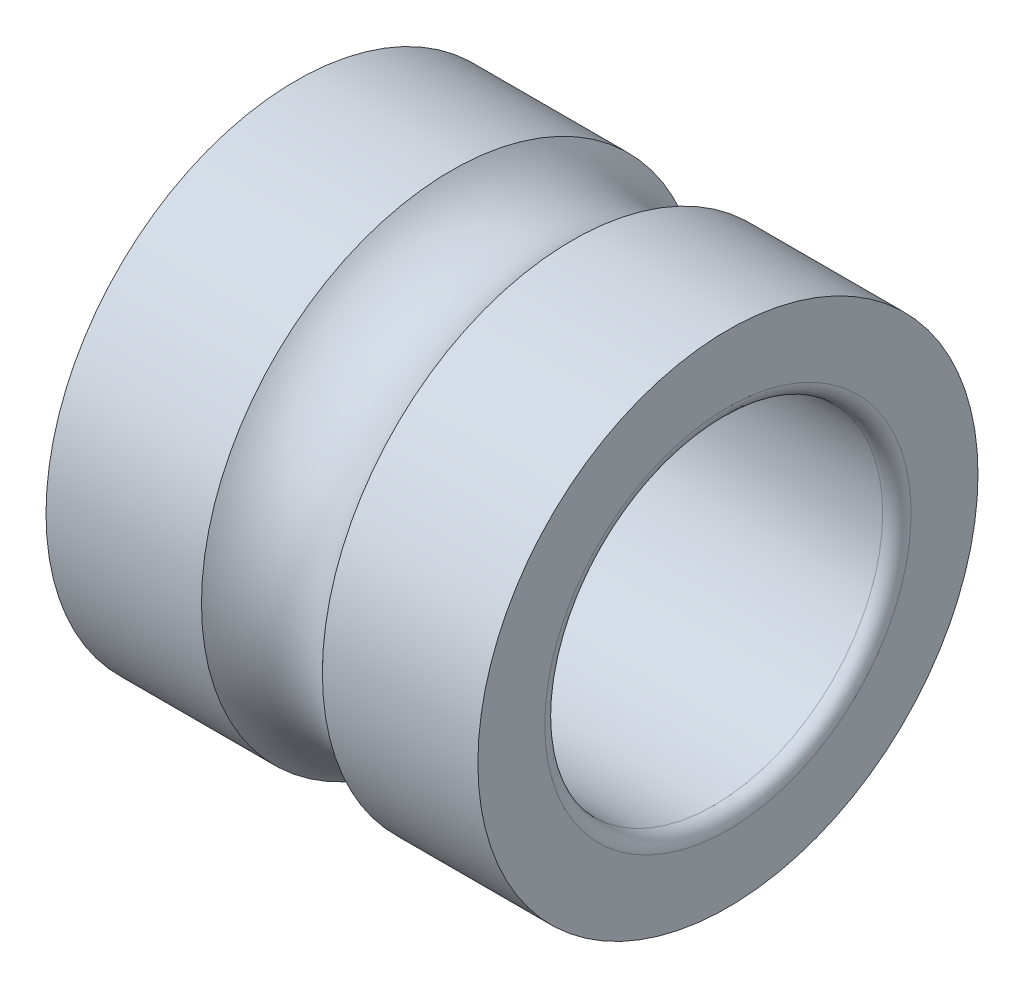
ISO-10303-21;
HEADER;
FILE_DESCRIPTION(('STEP AP214'),'2;1');
FILE_NAME('part.step','',(''),(''),'','','');
FILE_SCHEMA(('AUTOMOTIVE_DESIGN { 1 0 10303 214 1 1 1 1 }'));
ENDSEC;
DATA;
#1=APPLICATION_CONTEXT('core data for automotive mechanical design processes');
#2=APPLICATION_PROTOCOL_DEFINITION('international standard','automotive_design',2000,#1);
#3=PRODUCT_CONTEXT('',#1,'mechanical');
#4=PRODUCT('Part','Part','',(#3));
#5=PRODUCT_RELATED_PRODUCT_CATEGORY('part','',(#4));
#6=PRODUCT_DEFINITION_FORMATION('','',#4);
#7=PRODUCT_DEFINITION_CONTEXT('part definition',#1,'design');
#8=PRODUCT_DEFINITION('design','',#6,#7);
#9=PRODUCT_DEFINITION_SHAPE('','',#8);
#10=(LENGTH_UNIT() NAMED_UNIT(*) SI_UNIT(.MILLI.,.METRE.));
#11=(NAMED_UNIT(*) PLANE_ANGLE_UNIT() SI_UNIT($,.RADIAN.));
#12=(NAMED_UNIT(*) SI_UNIT($,.STERADIAN.) SOLID_ANGLE_UNIT());
#13=UNCERTAINTY_MEASURE_WITH_UNIT(LENGTH_MEASURE(1.E-05),#10,'distance_accuracy_value','');
#14=(GEOMETRIC_REPRESENTATION_CONTEXT(3) GLOBAL_UNCERTAINTY_ASSIGNED_CONTEXT((#13)) GLOBAL_UNIT_ASSIGNED_CONTEXT((#10,
#11,#12)) REPRESENTATION_CONTEXT('',''));
#15=CARTESIAN_POINT('',(0.,0.,0.));
#16=DIRECTION('',(0.,0.,1.));
#17=DIRECTION('',(1.,0.,0.));
#18=AXIS2_PLACEMENT_3D('',#15,#16,#17);
#19=CARTESIAN_POINT('',(-31.9494584837546,0.,0.));
#20=DIRECTION('',(1.,0.,0.));
#21=DIRECTION('',(0.,0.,-1.));
#22=AXIS2_PLACEMENT_3D('',#19,#20,#21);
#23=PLANE('',#22);
#24=CARTESIAN_POINT('',(-31.9494584837545,0.,0.));
#25=DIRECTION('',(-1.,0.,0.));
#26=DIRECTION('',(0.,0.,1.));
#27=AXIS2_PLACEMENT_3D('',#24,#25,#26);
#28=CIRCLE('',#27,27.1);
#29=CARTESIAN_POINT('',(-31.9494584837545,0.,27.1));
#30=VERTEX_POINT('',#29);
#31=EDGE_CURVE('E10',#30,#30,#28,.T.);
#32=ORIENTED_EDGE('',*,*,#31,.F.);
#33=EDGE_LOOP('',(#32));
#34=FACE_BOUND('',#33,.T.);
#35=CARTESIAN_POINT('',(-31.9494584837546,0.,0.));
#36=DIRECTION('',(-1.,0.,0.));
#37=DIRECTION('',(0.,0.,1.));
#38=AXIS2_PLACEMENT_3D('',#35,#36,#37);
#39=CIRCLE('',#38,37.);
#40=CARTESIAN_POINT('',(-31.9494584837546,0.,37.));
#41=VERTEX_POINT('',#40);
#42=EDGE_CURVE('E72',#41,#41,#39,.T.);
#43=ORIENTED_EDGE('',*,*,#42,.T.);
#44=EDGE_LOOP('',(#43));
#45=FACE_BOUND('',#44,.T.);
#46=ADVANCED_FACE('F37',(#34,#45),#23,.F.);
#47=CARTESIAN_POINT('',(-29.8494584837545,0.,0.));
#48=DIRECTION('',(-1.,0.,0.));
#49=DIRECTION('',(0.,0.,1.));
#50=AXIS2_PLACEMENT_3D('',#47,#48,#49);
#51=TOROIDAL_SURFACE('',#50,27.1,2.1);
#52=CARTESIAN_POINT('',(-29.8494584837545,0.,0.));
#53=DIRECTION('',(-1.,0.,0.));
#54=DIRECTION('',(0.,0.,1.));
#55=AXIS2_PLACEMENT_3D('',#52,#53,#54);
#56=CIRCLE('',#55,25.);
#57=CARTESIAN_POINT('',(-29.8494584837545,0.,25.));
#58=VERTEX_POINT('',#57);
#59=EDGE_CURVE('E44',#58,#58,#56,.T.);
#60=ORIENTED_EDGE('',*,*,#59,.F.);
#61=EDGE_LOOP('',(#60));
#62=FACE_BOUND('',#61,.T.);
#63=ORIENTED_EDGE('',*,*,#31,.T.);
#64=EDGE_LOOP('',(#63));
#65=FACE_BOUND('',#64,.T.);
#66=ADVANCED_FACE('F90',(#62,#65),#51,.T.);
#67=CARTESIAN_POINT('',(-48.9169675090253,0.,0.));
#68=DIRECTION('',(-1.,0.,0.));
#69=DIRECTION('',(0.,0.,1.));
#70=AXIS2_PLACEMENT_3D('',#67,#68,#69);
#71=CYLINDRICAL_SURFACE('',#70,25.);
#72=CARTESIAN_POINT('',(29.8494584837545,0.,0.));
#73=DIRECTION('',(-1.,0.,0.));
#74=DIRECTION('',(0.,0.,1.));
#75=AXIS2_PLACEMENT_3D('',#72,#73,#74);
#76=CIRCLE('',#75,25.);
#77=CARTESIAN_POINT('',(29.8494584837545,0.,25.));
#78=VERTEX_POINT('',#77);
#79=EDGE_CURVE('E49',#78,#78,#76,.T.);
#80=ORIENTED_EDGE('',*,*,#79,.F.);
#81=EDGE_LOOP('',(#80));
#82=FACE_BOUND('',#81,.T.);
#83=ORIENTED_EDGE('',*,*,#59,.T.);
#84=EDGE_LOOP('',(#83));
#85=FACE_BOUND('',#84,.T.);
#86=ADVANCED_FACE('F95',(#82,#85),#71,.F.);
#87=CARTESIAN_POINT('',(29.8494584837545,0.,0.));
#88=DIRECTION('',(-1.,0.,0.));
#89=DIRECTION('',(0.,0.,1.));
#90=AXIS2_PLACEMENT_3D('',#87,#88,#89);
#91=TOROIDAL_SURFACE('',#90,27.1,2.1);
#92=CARTESIAN_POINT('',(31.9494584837546,0.,0.));
#93=DIRECTION('',(-1.,0.,0.));
#94=DIRECTION('',(0.,0.,1.));
#95=AXIS2_PLACEMENT_3D('',#92,#93,#94);
#96=CIRCLE('',#95,27.1);
#97=CARTESIAN_POINT('',(31.9494584837546,0.,27.1));
#98=VERTEX_POINT('',#97);
#99=EDGE_CURVE('E54',#98,#98,#96,.T.);
#100=ORIENTED_EDGE('',*,*,#99,.F.);
#101=EDGE_LOOP('',(#100));
#102=FACE_BOUND('',#101,.T.);
#103=ORIENTED_EDGE('',*,*,#79,.T.);
#104=EDGE_LOOP('',(#103));
#105=FACE_BOUND('',#104,.T.);
#106=ADVANCED_FACE('F100',(#102,#105),#91,.T.);
#107=CARTESIAN_POINT('',(31.9494584837546,0.,0.));
#108=DIRECTION('',(1.,0.,0.));
#109=DIRECTION('',(0.,0.,-1.));
#110=AXIS2_PLACEMENT_3D('',#107,#108,#109);
#111=PLANE('',#110);
#112=ORIENTED_EDGE('',*,*,#99,.T.);
#113=EDGE_LOOP('',(#112));
#114=FACE_BOUND('',#113,.T.);
#115=CARTESIAN_POINT('',(31.9494584837546,0.,0.));
#116=DIRECTION('',(-1.,0.,0.));
#117=DIRECTION('',(0.,0.,1.));
#118=AXIS2_PLACEMENT_3D('',#115,#116,#117);
#119=CIRCLE('',#118,37.);
#120=CARTESIAN_POINT('',(31.9494584837546,0.,37.));
#121=VERTEX_POINT('',#120);
#122=EDGE_CURVE('E60',#121,#121,#119,.T.);
#123=ORIENTED_EDGE('',*,*,#122,.F.);
#124=EDGE_LOOP('',(#123));
#125=FACE_BOUND('',#124,.T.);
#126=ADVANCED_FACE('F106',(#114,#125),#111,.T.);
#127=CARTESIAN_POINT('',(-48.9169675090253,0.,0.));
#128=DIRECTION('',(-1.,0.,0.));
#129=DIRECTION('',(0.,0.,1.));
#130=AXIS2_PLACEMENT_3D('',#127,#128,#129);
#131=CYLINDRICAL_SURFACE('',#130,37.);
#132=ORIENTED_EDGE('',*,*,#122,.T.);
#133=EDGE_LOOP('',(#132));
#134=FACE_BOUND('',#133,.T.);
#135=CARTESIAN_POINT('',(8.94427190999916,0.,0.));
#136=DIRECTION('',(-1.,0.,0.));
#137=DIRECTION('',(0.,0.,1.));
#138=AXIS2_PLACEMENT_3D('',#135,#136,#137);
#139=CIRCLE('',#138,37.);
#140=CARTESIAN_POINT('',(8.94427190999916,0.,37.));
#141=VERTEX_POINT('',#140);
#142=EDGE_CURVE('E64',#141,#141,#139,.T.);
#143=ORIENTED_EDGE('',*,*,#142,.F.);
#144=EDGE_LOOP('',(#143));
#145=FACE_BOUND('',#144,.T.);
#146=ADVANCED_FACE('F86',(#134,#145),#131,.T.);
#147=CARTESIAN_POINT('',(0.,0.,0.));
#148=DIRECTION('',(-1.,0.,0.));
#149=DIRECTION('',(0.,0.,1.));
#150=AXIS2_PLACEMENT_3D('',#147,#148,#149);
#151=TOROIDAL_SURFACE('',#150,45.,12.);
#152=CARTESIAN_POINT('',(-8.94427190999916,0.,0.));
#153=DIRECTION('',(-1.,0.,0.));
#154=DIRECTION('',(0.,0.,1.));
#155=AXIS2_PLACEMENT_3D('',#152,#153,#154);
#156=CIRCLE('',#155,37.);
#157=CARTESIAN_POINT('',(-8.94427190999916,0.,37.));
#158=VERTEX_POINT('',#157);
#159=EDGE_CURVE('E68',#158,#158,#156,.T.);
#160=ORIENTED_EDGE('',*,*,#159,.F.);
#161=EDGE_LOOP('',(#160));
#162=FACE_BOUND('',#161,.T.);
#163=ORIENTED_EDGE('',*,*,#142,.T.);
#164=EDGE_LOOP('',(#163));
#165=FACE_BOUND('',#164,.T.);
#166=ADVANCED_FACE('F80',(#162,#165),#151,.F.);
#167=CARTESIAN_POINT('',(-48.9169675090253,0.,0.));
#168=DIRECTION('',(-1.,0.,0.));
#169=DIRECTION('',(0.,0.,1.));
#170=AXIS2_PLACEMENT_3D('',#167,#168,#169);
#171=CYLINDRICAL_SURFACE('',#170,37.);
#172=ORIENTED_EDGE('',*,*,#159,.T.);
#173=EDGE_LOOP('',(#172));
#174=FACE_BOUND('',#173,.T.);
#175=ORIENTED_EDGE('',*,*,#42,.F.);
#176=EDGE_LOOP('',(#175));
#177=FACE_BOUND('',#176,.T.);
#178=ADVANCED_FACE('F78',(#174,#177),#171,.T.);
#179=CLOSED_SHELL('',(#46,#66,#86,#106,#126,#146,#166,#178));
#180=MANIFOLD_SOLID_BREP('B2',#179);
#181=ADVANCED_BREP_SHAPE_REPRESENTATION('',(#18,#180),#14);
#182=SHAPE_DEFINITION_REPRESENTATION(#9,#181);
ENDSEC;
END-ISO-10303-21;
